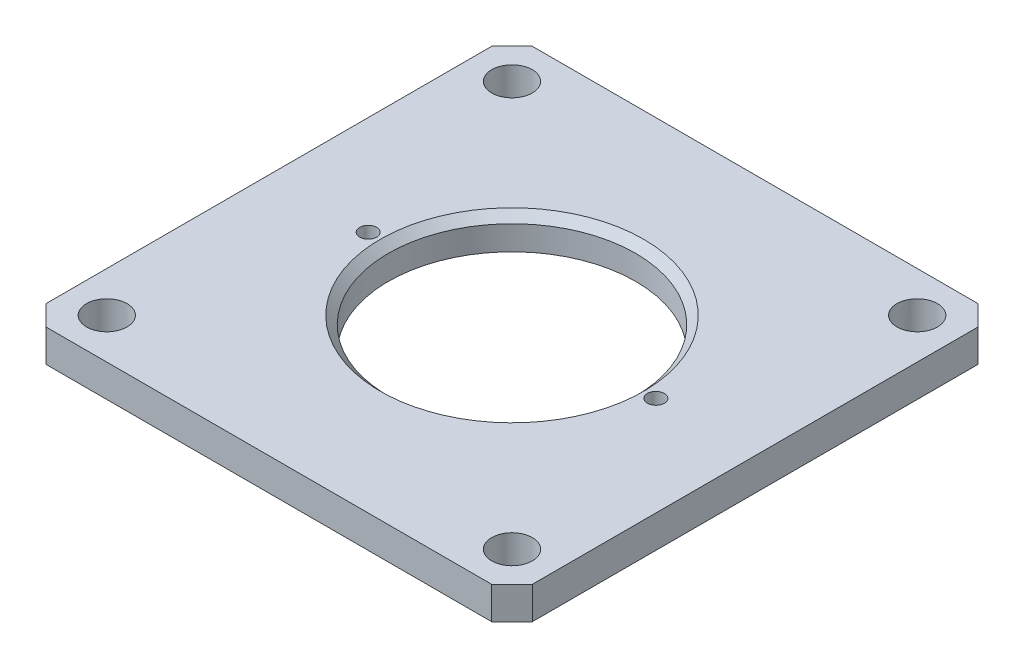
ISO-10303-21;
HEADER;
FILE_DESCRIPTION(('STEP AP214'),'2;1');
FILE_NAME('part.step','',(''),(''),'','','');
FILE_SCHEMA(('AUTOMOTIVE_DESIGN { 1 0 10303 214 1 1 1 1 }'));
ENDSEC;
DATA;
#1=APPLICATION_CONTEXT('core data for automotive mechanical design processes');
#2=APPLICATION_PROTOCOL_DEFINITION('international standard','automotive_design',2000,#1);
#3=PRODUCT_CONTEXT('',#1,'mechanical');
#4=PRODUCT('Part','Part','',(#3));
#5=PRODUCT_RELATED_PRODUCT_CATEGORY('part','',(#4));
#6=PRODUCT_DEFINITION_FORMATION('','',#4);
#7=PRODUCT_DEFINITION_CONTEXT('part definition',#1,'design');
#8=PRODUCT_DEFINITION('design','',#6,#7);
#9=PRODUCT_DEFINITION_SHAPE('','',#8);
#10=(LENGTH_UNIT() NAMED_UNIT(*) SI_UNIT(.MILLI.,.METRE.));
#11=(NAMED_UNIT(*) PLANE_ANGLE_UNIT() SI_UNIT($,.RADIAN.));
#12=(NAMED_UNIT(*) SI_UNIT($,.STERADIAN.) SOLID_ANGLE_UNIT());
#13=UNCERTAINTY_MEASURE_WITH_UNIT(LENGTH_MEASURE(1.E-05),#10,'distance_accuracy_value','');
#14=(GEOMETRIC_REPRESENTATION_CONTEXT(3) GLOBAL_UNCERTAINTY_ASSIGNED_CONTEXT((#13)) GLOBAL_UNIT_ASSIGNED_CONTEXT((#10,
#11,#12)) REPRESENTATION_CONTEXT('',''));
#15=CARTESIAN_POINT('',(0.,0.,0.));
#16=DIRECTION('',(0.,0.,1.));
#17=DIRECTION('',(1.,0.,0.));
#18=AXIS2_PLACEMENT_3D('',#15,#16,#17);
#19=CARTESIAN_POINT('',(0.,0.,0.));
#20=DIRECTION('',(0.,-1.,0.));
#21=DIRECTION('',(0.,0.,-1.));
#22=AXIS2_PLACEMENT_3D('',#19,#20,#21);
#23=PLANE('',#22);
#24=DIRECTION('',(-1.,0.,0.));
#25=VECTOR('',#24,1.);
#26=CARTESIAN_POINT('',(-60.,0.,-60.));
#27=LINE('',#26,#25);
#28=CARTESIAN_POINT('',(55.0000000000001,0.,-60.));
#29=VERTEX_POINT('',#28);
#30=CARTESIAN_POINT('',(-55.,0.,-60.));
#31=VERTEX_POINT('',#30);
#32=EDGE_CURVE('E121',#29,#31,#27,.T.);
#33=ORIENTED_EDGE('',*,*,#32,.F.);
#34=DIRECTION('',(-0.707106781186544,0.,-0.707106781186551));
#35=VECTOR('',#34,1.);
#36=CARTESIAN_POINT('',(57.5000000000003,0.,-57.4999999999997));
#37=LINE('',#36,#35);
#38=CARTESIAN_POINT('',(60.,0.,-55.));
#39=VERTEX_POINT('',#38);
#40=EDGE_CURVE('E104',#29,#39,#37,.F.);
#41=ORIENTED_EDGE('',*,*,#40,.T.);
#42=DIRECTION('',(0.,0.,-1.));
#43=VECTOR('',#42,1.);
#44=CARTESIAN_POINT('',(60.,0.,60.));
#45=LINE('',#44,#43);
#46=CARTESIAN_POINT('',(60.,0.,55.));
#47=VERTEX_POINT('',#46);
#48=EDGE_CURVE('E132',#47,#39,#45,.T.);
#49=ORIENTED_EDGE('',*,*,#48,.F.);
#50=DIRECTION('',(0.707106781186551,0.,-0.707106781186544));
#51=VECTOR('',#50,1.);
#52=CARTESIAN_POINT('',(57.4999999999997,0.,57.5000000000003));
#53=LINE('',#52,#51);
#54=CARTESIAN_POINT('',(55.,0.,60.));
#55=VERTEX_POINT('',#54);
#56=EDGE_CURVE('E115',#47,#55,#53,.F.);
#57=ORIENTED_EDGE('',*,*,#56,.T.);
#58=DIRECTION('',(1.,0.,0.));
#59=VECTOR('',#58,1.);
#60=CARTESIAN_POINT('',(-60.,0.,60.));
#61=LINE('',#60,#59);
#62=CARTESIAN_POINT('',(-55.,0.,60.));
#63=VERTEX_POINT('',#62);
#64=EDGE_CURVE('E136',#63,#55,#61,.T.);
#65=ORIENTED_EDGE('',*,*,#64,.F.);
#66=DIRECTION('',(0.707106781186545,0.,0.70710678118655));
#67=VECTOR('',#66,1.);
#68=CARTESIAN_POINT('',(-57.5000000000002,0.,57.4999999999998));
#69=LINE('',#68,#67);
#70=CARTESIAN_POINT('',(-60.,0.,55.));
#71=VERTEX_POINT('',#70);
#72=EDGE_CURVE('E125',#63,#71,#69,.F.);
#73=ORIENTED_EDGE('',*,*,#72,.T.);
#74=DIRECTION('',(0.,0.,1.));
#75=VECTOR('',#74,1.);
#76=CARTESIAN_POINT('',(-60.,0.,60.));
#77=LINE('',#76,#75);
#78=CARTESIAN_POINT('',(-60.,0.,-55.));
#79=VERTEX_POINT('',#78);
#80=EDGE_CURVE('E169',#79,#71,#77,.T.);
#81=ORIENTED_EDGE('',*,*,#80,.F.);
#82=DIRECTION('',(-0.707106781186549,0.,0.707106781186546));
#83=VECTOR('',#82,1.);
#84=CARTESIAN_POINT('',(-57.4999999999998,0.,-57.5000000000001));
#85=LINE('',#84,#83);
#86=EDGE_CURVE('E130',#79,#31,#85,.F.);
#87=ORIENTED_EDGE('',*,*,#86,.T.);
#88=EDGE_LOOP('',(#33,#41,#49,#57,#65,#73,#81,#87));
#89=FACE_BOUND('',#88,.T.);
#90=CARTESIAN_POINT('',(0.,0.,0.));
#91=DIRECTION('',(0.,-1.,0.));
#92=DIRECTION('',(0.,0.,-1.));
#93=AXIS2_PLACEMENT_3D('',#90,#91,#92);
#94=CIRCLE('',#93,30.5);
#95=CARTESIAN_POINT('',(0.,0.,-30.5));
#96=VERTEX_POINT('',#95);
#97=EDGE_CURVE('E178',#96,#96,#94,.F.);
#98=ORIENTED_EDGE('',*,*,#97,.T.);
#99=EDGE_LOOP('',(#98));
#100=FACE_BOUND('',#99,.T.);
#101=CARTESIAN_POINT('',(-50.,0.,-50.));
#102=DIRECTION('',(0.,-1.,0.));
#103=DIRECTION('',(0.,0.,-1.));
#104=AXIS2_PLACEMENT_3D('',#101,#102,#103);
#105=CIRCLE('',#104,5.00000000000001);
#106=CARTESIAN_POINT('',(-50.,0.,-55.));
#107=VERTEX_POINT('',#106);
#108=EDGE_CURVE('E188',#107,#107,#105,.F.);
#109=ORIENTED_EDGE('',*,*,#108,.T.);
#110=EDGE_LOOP('',(#109));
#111=FACE_BOUND('',#110,.T.);
#112=CARTESIAN_POINT('',(50.,0.,-50.));
#113=DIRECTION('',(0.,-1.,0.));
#114=DIRECTION('',(0.,0.,-1.));
#115=AXIS2_PLACEMENT_3D('',#112,#113,#114);
#116=CIRCLE('',#115,5.00000000000001);
#117=CARTESIAN_POINT('',(50.,0.,-55.));
#118=VERTEX_POINT('',#117);
#119=EDGE_CURVE('E194',#118,#118,#116,.F.);
#120=ORIENTED_EDGE('',*,*,#119,.T.);
#121=EDGE_LOOP('',(#120));
#122=FACE_BOUND('',#121,.T.);
#123=CARTESIAN_POINT('',(-50.,0.,50.));
#124=DIRECTION('',(0.,-1.,0.));
#125=DIRECTION('',(0.,0.,-1.));
#126=AXIS2_PLACEMENT_3D('',#123,#124,#125);
#127=CIRCLE('',#126,5.00000000000001);
#128=CARTESIAN_POINT('',(-50.,0.,45.));
#129=VERTEX_POINT('',#128);
#130=EDGE_CURVE('E200',#129,#129,#127,.F.);
#131=ORIENTED_EDGE('',*,*,#130,.T.);
#132=EDGE_LOOP('',(#131));
#133=FACE_BOUND('',#132,.T.);
#134=CARTESIAN_POINT('',(50.,0.,50.));
#135=DIRECTION('',(0.,-1.,0.));
#136=DIRECTION('',(0.,0.,-1.));
#137=AXIS2_PLACEMENT_3D('',#134,#135,#136);
#138=CIRCLE('',#137,5.00000000000001);
#139=CARTESIAN_POINT('',(50.,0.,45.));
#140=VERTEX_POINT('',#139);
#141=EDGE_CURVE('E206',#140,#140,#138,.F.);
#142=ORIENTED_EDGE('',*,*,#141,.T.);
#143=EDGE_LOOP('',(#142));
#144=FACE_BOUND('',#143,.T.);
#145=CARTESIAN_POINT('',(35.5,0.,0.));
#146=DIRECTION('',(0.,1.,0.));
#147=DIRECTION('',(0.,0.,1.));
#148=AXIS2_PLACEMENT_3D('',#145,#146,#147);
#149=CIRCLE('',#148,2.1);
#150=CARTESIAN_POINT('',(35.5,0.,2.09999999999998));
#151=VERTEX_POINT('',#150);
#152=EDGE_CURVE('E209',#151,#151,#149,.T.);
#153=ORIENTED_EDGE('',*,*,#152,.T.);
#154=EDGE_LOOP('',(#153));
#155=FACE_BOUND('',#154,.T.);
#156=CARTESIAN_POINT('',(-35.5,0.,0.));
#157=DIRECTION('',(0.,1.,0.));
#158=DIRECTION('',(0.,0.,1.));
#159=AXIS2_PLACEMENT_3D('',#156,#157,#158);
#160=CIRCLE('',#159,2.1);
#161=CARTESIAN_POINT('',(-35.5,0.,2.1));
#162=VERTEX_POINT('',#161);
#163=EDGE_CURVE('E217',#162,#162,#160,.T.);
#164=ORIENTED_EDGE('',*,*,#163,.T.);
#165=EDGE_LOOP('',(#164));
#166=FACE_BOUND('',#165,.T.);
#167=ADVANCED_FACE('F37',(#89,#100,#111,#122,#133,#144,#155,#166),#23,.T.);
#168=CARTESIAN_POINT('',(0.,8.,0.));
#169=DIRECTION('',(0.,-1.,0.));
#170=DIRECTION('',(0.,0.,-1.));
#171=AXIS2_PLACEMENT_3D('',#168,#169,#170);
#172=PLANE('',#171);
#173=DIRECTION('',(0.,0.,-1.));
#174=VECTOR('',#173,1.);
#175=CARTESIAN_POINT('',(60.,8.,60.));
#176=LINE('',#175,#174);
#177=CARTESIAN_POINT('',(60.,8.,55.));
#178=VERTEX_POINT('',#177);
#179=CARTESIAN_POINT('',(60.,8.,-55.));
#180=VERTEX_POINT('',#179);
#181=EDGE_CURVE('E182',#178,#180,#176,.T.);
#182=ORIENTED_EDGE('',*,*,#181,.T.);
#183=DIRECTION('',(0.707106781186544,0.,0.707106781186551));
#184=VECTOR('',#183,1.);
#185=CARTESIAN_POINT('',(55.,8.,-60.));
#186=LINE('',#185,#184);
#187=CARTESIAN_POINT('',(55.,8.,-60.));
#188=VERTEX_POINT('',#187);
#189=EDGE_CURVE('E158',#180,#188,#186,.F.);
#190=ORIENTED_EDGE('',*,*,#189,.T.);
#191=DIRECTION('',(-1.,0.,0.));
#192=VECTOR('',#191,1.);
#193=CARTESIAN_POINT('',(-60.,8.,-60.));
#194=LINE('',#193,#192);
#195=CARTESIAN_POINT('',(-55.,8.,-60.));
#196=VERTEX_POINT('',#195);
#197=EDGE_CURVE('E124',#188,#196,#194,.T.);
#198=ORIENTED_EDGE('',*,*,#197,.T.);
#199=DIRECTION('',(0.707106781186549,0.,-0.707106781186546));
#200=VECTOR('',#199,1.);
#201=CARTESIAN_POINT('',(-60.,8.,-55.));
#202=LINE('',#201,#200);
#203=CARTESIAN_POINT('',(-60.,8.,-55.));
#204=VERTEX_POINT('',#203);
#205=EDGE_CURVE('E154',#196,#204,#202,.F.);
#206=ORIENTED_EDGE('',*,*,#205,.T.);
#207=DIRECTION('',(0.,0.,1.));
#208=VECTOR('',#207,1.);
#209=CARTESIAN_POINT('',(-60.,8.,60.));
#210=LINE('',#209,#208);
#211=CARTESIAN_POINT('',(-60.,8.,55.));
#212=VERTEX_POINT('',#211);
#213=EDGE_CURVE('E131',#204,#212,#210,.T.);
#214=ORIENTED_EDGE('',*,*,#213,.T.);
#215=DIRECTION('',(-0.707106781186545,0.,-0.70710678118655));
#216=VECTOR('',#215,1.);
#217=CARTESIAN_POINT('',(-55.,8.,60.));
#218=LINE('',#217,#216);
#219=CARTESIAN_POINT('',(-55.,8.,60.));
#220=VERTEX_POINT('',#219);
#221=EDGE_CURVE('E59',#212,#220,#218,.F.);
#222=ORIENTED_EDGE('',*,*,#221,.T.);
#223=DIRECTION('',(1.,0.,0.));
#224=VECTOR('',#223,1.);
#225=CARTESIAN_POINT('',(-60.,8.,60.));
#226=LINE('',#225,#224);
#227=CARTESIAN_POINT('',(54.9999999999999,8.,60.));
#228=VERTEX_POINT('',#227);
#229=EDGE_CURVE('E134',#220,#228,#226,.T.);
#230=ORIENTED_EDGE('',*,*,#229,.T.);
#231=DIRECTION('',(-0.707106781186551,0.,0.707106781186544));
#232=VECTOR('',#231,1.);
#233=CARTESIAN_POINT('',(60.,8.,55.));
#234=LINE('',#233,#232);
#235=EDGE_CURVE('E156',#228,#178,#234,.F.);
#236=ORIENTED_EDGE('',*,*,#235,.T.);
#237=EDGE_LOOP('',(#182,#190,#198,#206,#214,#222,#230,#236));
#238=FACE_BOUND('',#237,.T.);
#239=CARTESIAN_POINT('',(0.,8.,0.));
#240=DIRECTION('',(0.,-1.,0.));
#241=DIRECTION('',(0.,0.,-1.));
#242=AXIS2_PLACEMENT_3D('',#239,#240,#241);
#243=CIRCLE('',#242,32.5);
#244=CARTESIAN_POINT('',(0.,8.,-32.5));
#245=VERTEX_POINT('',#244);
#246=EDGE_CURVE('E143',#245,#245,#243,.T.);
#247=ORIENTED_EDGE('',*,*,#246,.T.);
#248=EDGE_LOOP('',(#247));
#249=FACE_BOUND('',#248,.T.);
#250=CARTESIAN_POINT('',(-50.,8.,-50.));
#251=DIRECTION('',(0.,1.,0.));
#252=DIRECTION('',(0.,0.,1.));
#253=AXIS2_PLACEMENT_3D('',#250,#251,#252);
#254=CIRCLE('',#253,5.00000000000001);
#255=CARTESIAN_POINT('',(-50.,8.,-45.));
#256=VERTEX_POINT('',#255);
#257=EDGE_CURVE('E187',#256,#256,#254,.T.);
#258=ORIENTED_EDGE('',*,*,#257,.F.);
#259=EDGE_LOOP('',(#258));
#260=FACE_BOUND('',#259,.T.);
#261=CARTESIAN_POINT('',(50.,8.,-50.));
#262=DIRECTION('',(0.,1.,0.));
#263=DIRECTION('',(0.,0.,1.));
#264=AXIS2_PLACEMENT_3D('',#261,#262,#263);
#265=CIRCLE('',#264,5.00000000000001);
#266=CARTESIAN_POINT('',(50.,8.,-45.));
#267=VERTEX_POINT('',#266);
#268=EDGE_CURVE('E191',#267,#267,#265,.T.);
#269=ORIENTED_EDGE('',*,*,#268,.F.);
#270=EDGE_LOOP('',(#269));
#271=FACE_BOUND('',#270,.T.);
#272=CARTESIAN_POINT('',(-50.,8.,50.));
#273=DIRECTION('',(0.,1.,0.));
#274=DIRECTION('',(0.,0.,1.));
#275=AXIS2_PLACEMENT_3D('',#272,#273,#274);
#276=CIRCLE('',#275,5.00000000000001);
#277=CARTESIAN_POINT('',(-50.,8.,55.));
#278=VERTEX_POINT('',#277);
#279=EDGE_CURVE('E197',#278,#278,#276,.T.);
#280=ORIENTED_EDGE('',*,*,#279,.F.);
#281=EDGE_LOOP('',(#280));
#282=FACE_BOUND('',#281,.T.);
#283=CARTESIAN_POINT('',(50.,8.,50.));
#284=DIRECTION('',(0.,1.,0.));
#285=DIRECTION('',(0.,0.,1.));
#286=AXIS2_PLACEMENT_3D('',#283,#284,#285);
#287=CIRCLE('',#286,5.00000000000001);
#288=CARTESIAN_POINT('',(50.,8.,55.));
#289=VERTEX_POINT('',#288);
#290=EDGE_CURVE('E203',#289,#289,#287,.T.);
#291=ORIENTED_EDGE('',*,*,#290,.F.);
#292=EDGE_LOOP('',(#291));
#293=FACE_BOUND('',#292,.T.);
#294=CARTESIAN_POINT('',(35.5,8.,0.));
#295=DIRECTION('',(0.,1.,0.));
#296=DIRECTION('',(0.,0.,1.));
#297=AXIS2_PLACEMENT_3D('',#294,#295,#296);
#298=CIRCLE('',#297,2.1);
#299=CARTESIAN_POINT('',(35.5,8.,2.09999999999998));
#300=VERTEX_POINT('',#299);
#301=EDGE_CURVE('E214',#300,#300,#298,.T.);
#302=ORIENTED_EDGE('',*,*,#301,.F.);
#303=EDGE_LOOP('',(#302));
#304=FACE_BOUND('',#303,.T.);
#305=CARTESIAN_POINT('',(-35.5,8.,0.));
#306=DIRECTION('',(0.,1.,0.));
#307=DIRECTION('',(0.,0.,1.));
#308=AXIS2_PLACEMENT_3D('',#305,#306,#307);
#309=CIRCLE('',#308,2.1);
#310=CARTESIAN_POINT('',(-35.5,8.,2.1));
#311=VERTEX_POINT('',#310);
#312=EDGE_CURVE('E220',#311,#311,#309,.T.);
#313=ORIENTED_EDGE('',*,*,#312,.F.);
#314=EDGE_LOOP('',(#313));
#315=FACE_BOUND('',#314,.T.);
#316=ADVANCED_FACE('F172',(#238,#249,#260,#271,#282,#293,#304,#315),#172,.F.);
#317=CARTESIAN_POINT('',(-60.,8.,60.));
#318=DIRECTION('',(1.,0.,0.));
#319=DIRECTION('',(0.,0.,-1.));
#320=AXIS2_PLACEMENT_3D('',#317,#318,#319);
#321=PLANE('',#320);
#322=ORIENTED_EDGE('',*,*,#213,.F.);
#323=DIRECTION('',(0.,-1.,0.));
#324=VECTOR('',#323,1.);
#325=CARTESIAN_POINT('',(-60.,8.,-55.));
#326=LINE('',#325,#324);
#327=EDGE_CURVE('E11',#204,#79,#326,.T.);
#328=ORIENTED_EDGE('',*,*,#327,.T.);
#329=ORIENTED_EDGE('',*,*,#80,.T.);
#330=DIRECTION('',(0.,1.,0.));
#331=VECTOR('',#330,1.);
#332=CARTESIAN_POINT('',(-60.,8.,55.));
#333=LINE('',#332,#331);
#334=EDGE_CURVE('E45',#71,#212,#333,.T.);
#335=ORIENTED_EDGE('',*,*,#334,.T.);
#336=EDGE_LOOP('',(#322,#328,#329,#335));
#337=FACE_BOUND('',#336,.T.);
#338=ADVANCED_FACE('F167',(#337),#321,.F.);
#339=CARTESIAN_POINT('',(-60.,8.,60.));
#340=DIRECTION('',(0.,0.,-1.));
#341=DIRECTION('',(-1.,0.,0.));
#342=AXIS2_PLACEMENT_3D('',#339,#340,#341);
#343=PLANE('',#342);
#344=ORIENTED_EDGE('',*,*,#64,.T.);
#345=DIRECTION('',(0.,1.,0.));
#346=VECTOR('',#345,1.);
#347=CARTESIAN_POINT('',(55.,8.,60.));
#348=LINE('',#347,#346);
#349=EDGE_CURVE('E52',#55,#228,#348,.T.);
#350=ORIENTED_EDGE('',*,*,#349,.T.);
#351=ORIENTED_EDGE('',*,*,#229,.F.);
#352=DIRECTION('',(0.,-1.,0.));
#353=VECTOR('',#352,1.);
#354=CARTESIAN_POINT('',(-55.,8.,60.));
#355=LINE('',#354,#353);
#356=EDGE_CURVE('E160',#220,#63,#355,.T.);
#357=ORIENTED_EDGE('',*,*,#356,.T.);
#358=EDGE_LOOP('',(#344,#350,#351,#357));
#359=FACE_BOUND('',#358,.T.);
#360=ADVANCED_FACE('F177',(#359),#343,.F.);
#361=CARTESIAN_POINT('',(60.,8.,60.));
#362=DIRECTION('',(-1.,0.,0.));
#363=DIRECTION('',(0.,0.,1.));
#364=AXIS2_PLACEMENT_3D('',#361,#362,#363);
#365=PLANE('',#364);
#366=ORIENTED_EDGE('',*,*,#48,.T.);
#367=DIRECTION('',(0.,1.,0.));
#368=VECTOR('',#367,1.);
#369=CARTESIAN_POINT('',(60.,8.,-55.));
#370=LINE('',#369,#368);
#371=EDGE_CURVE('E109',#39,#180,#370,.T.);
#372=ORIENTED_EDGE('',*,*,#371,.T.);
#373=ORIENTED_EDGE('',*,*,#181,.F.);
#374=DIRECTION('',(0.,-1.,0.));
#375=VECTOR('',#374,1.);
#376=CARTESIAN_POINT('',(60.,8.,55.));
#377=LINE('',#376,#375);
#378=EDGE_CURVE('E114',#178,#47,#377,.T.);
#379=ORIENTED_EDGE('',*,*,#378,.T.);
#380=EDGE_LOOP('',(#366,#372,#373,#379));
#381=FACE_BOUND('',#380,.T.);
#382=ADVANCED_FACE('F240',(#381),#365,.F.);
#383=CARTESIAN_POINT('',(-60.,8.,-60.));
#384=DIRECTION('',(0.,0.,1.));
#385=DIRECTION('',(1.,0.,0.));
#386=AXIS2_PLACEMENT_3D('',#383,#384,#385);
#387=PLANE('',#386);
#388=ORIENTED_EDGE('',*,*,#197,.F.);
#389=DIRECTION('',(0.,-1.,0.));
#390=VECTOR('',#389,1.);
#391=CARTESIAN_POINT('',(55.,8.,-60.));
#392=LINE('',#391,#390);
#393=EDGE_CURVE('E108',#188,#29,#392,.T.);
#394=ORIENTED_EDGE('',*,*,#393,.T.);
#395=ORIENTED_EDGE('',*,*,#32,.T.);
#396=DIRECTION('',(0.,1.,0.));
#397=VECTOR('',#396,1.);
#398=CARTESIAN_POINT('',(-55.,8.,-60.));
#399=LINE('',#398,#397);
#400=EDGE_CURVE('E126',#31,#196,#399,.T.);
#401=ORIENTED_EDGE('',*,*,#400,.T.);
#402=EDGE_LOOP('',(#388,#394,#395,#401));
#403=FACE_BOUND('',#402,.T.);
#404=ADVANCED_FACE('F120',(#403),#387,.F.);
#405=CARTESIAN_POINT('',(0.,-0.000999999999999265,0.));
#406=DIRECTION('',(0.,1.,0.));
#407=DIRECTION('',(0.,0.,1.));
#408=AXIS2_PLACEMENT_3D('',#405,#406,#407);
#409=CYLINDRICAL_SURFACE('',#408,30.5);
#410=CARTESIAN_POINT('',(0.,6.00000000000002,0.));
#411=DIRECTION('',(0.,-1.,0.));
#412=DIRECTION('',(0.,0.,-1.));
#413=AXIS2_PLACEMENT_3D('',#410,#411,#412);
#414=CIRCLE('',#413,30.5);
#415=CARTESIAN_POINT('',(0.,6.00000000000002,-30.5));
#416=VERTEX_POINT('',#415);
#417=EDGE_CURVE('E140',#416,#416,#414,.F.);
#418=ORIENTED_EDGE('',*,*,#417,.T.);
#419=EDGE_LOOP('',(#418));
#420=FACE_BOUND('',#419,.T.);
#421=ORIENTED_EDGE('',*,*,#97,.F.);
#422=EDGE_LOOP('',(#421));
#423=FACE_BOUND('',#422,.T.);
#424=ADVANCED_FACE('F235',(#420,#423),#409,.F.);
#425=CARTESIAN_POINT('',(0.,6.00000000000002,0.));
#426=DIRECTION('',(0.,1.,0.));
#427=DIRECTION('',(0.,0.,1.));
#428=AXIS2_PLACEMENT_3D('',#425,#426,#427);
#429=CONICAL_SURFACE('',#428,30.5,0.785398163397449);
#430=ORIENTED_EDGE('',*,*,#246,.F.);
#431=EDGE_LOOP('',(#430));
#432=FACE_BOUND('',#431,.T.);
#433=ORIENTED_EDGE('',*,*,#417,.F.);
#434=EDGE_LOOP('',(#433));
#435=FACE_BOUND('',#434,.T.);
#436=ADVANCED_FACE('F246',(#432,#435),#429,.F.);
#437=CARTESIAN_POINT('',(-50.,-0.000999999999999265,-50.));
#438=DIRECTION('',(0.,1.,0.));
#439=DIRECTION('',(0.,0.,1.));
#440=AXIS2_PLACEMENT_3D('',#437,#438,#439);
#441=CYLINDRICAL_SURFACE('',#440,5.00000000000001);
#442=ORIENTED_EDGE('',*,*,#108,.F.);
#443=EDGE_LOOP('',(#442));
#444=FACE_BOUND('',#443,.T.);
#445=ORIENTED_EDGE('',*,*,#257,.T.);
#446=EDGE_LOOP('',(#445));
#447=FACE_BOUND('',#446,.T.);
#448=ADVANCED_FACE('F249',(#444,#447),#441,.F.);
#449=CARTESIAN_POINT('',(50.,-0.000999999999999265,-50.));
#450=DIRECTION('',(0.,1.,0.));
#451=DIRECTION('',(0.,0.,1.));
#452=AXIS2_PLACEMENT_3D('',#449,#450,#451);
#453=CYLINDRICAL_SURFACE('',#452,5.00000000000001);
#454=ORIENTED_EDGE('',*,*,#119,.F.);
#455=EDGE_LOOP('',(#454));
#456=FACE_BOUND('',#455,.T.);
#457=ORIENTED_EDGE('',*,*,#268,.T.);
#458=EDGE_LOOP('',(#457));
#459=FACE_BOUND('',#458,.T.);
#460=ADVANCED_FACE('F286',(#456,#459),#453,.F.);
#461=CARTESIAN_POINT('',(-50.,-0.000999999999999265,50.));
#462=DIRECTION('',(0.,1.,0.));
#463=DIRECTION('',(0.,0.,1.));
#464=AXIS2_PLACEMENT_3D('',#461,#462,#463);
#465=CYLINDRICAL_SURFACE('',#464,5.00000000000001);
#466=ORIENTED_EDGE('',*,*,#130,.F.);
#467=EDGE_LOOP('',(#466));
#468=FACE_BOUND('',#467,.T.);
#469=ORIENTED_EDGE('',*,*,#279,.T.);
#470=EDGE_LOOP('',(#469));
#471=FACE_BOUND('',#470,.T.);
#472=ADVANCED_FACE('F282',(#468,#471),#465,.F.);
#473=CARTESIAN_POINT('',(50.,-0.000999999999999265,50.));
#474=DIRECTION('',(0.,1.,0.));
#475=DIRECTION('',(0.,0.,1.));
#476=AXIS2_PLACEMENT_3D('',#473,#474,#475);
#477=CYLINDRICAL_SURFACE('',#476,5.00000000000001);
#478=ORIENTED_EDGE('',*,*,#141,.F.);
#479=EDGE_LOOP('',(#478));
#480=FACE_BOUND('',#479,.T.);
#481=ORIENTED_EDGE('',*,*,#290,.T.);
#482=EDGE_LOOP('',(#481));
#483=FACE_BOUND('',#482,.T.);
#484=ADVANCED_FACE('F254',(#480,#483),#477,.F.);
#485=CARTESIAN_POINT('',(55.,8.,-60.));
#486=DIRECTION('',(-0.707106781186551,0.,0.707106781186544));
#487=DIRECTION('',(0.,-1.,0.));
#488=AXIS2_PLACEMENT_3D('',#485,#486,#487);
#489=PLANE('',#488);
#490=ORIENTED_EDGE('',*,*,#189,.F.);
#491=ORIENTED_EDGE('',*,*,#371,.F.);
#492=ORIENTED_EDGE('',*,*,#40,.F.);
#493=ORIENTED_EDGE('',*,*,#393,.F.);
#494=EDGE_LOOP('',(#490,#491,#492,#493));
#495=FACE_BOUND('',#494,.T.);
#496=ADVANCED_FACE('F107',(#495),#489,.F.);
#497=CARTESIAN_POINT('',(60.,8.,55.));
#498=DIRECTION('',(-0.707106781186544,0.,-0.707106781186551));
#499=DIRECTION('',(0.,-1.,0.));
#500=AXIS2_PLACEMENT_3D('',#497,#498,#499);
#501=PLANE('',#500);
#502=ORIENTED_EDGE('',*,*,#235,.F.);
#503=ORIENTED_EDGE('',*,*,#349,.F.);
#504=ORIENTED_EDGE('',*,*,#56,.F.);
#505=ORIENTED_EDGE('',*,*,#378,.F.);
#506=EDGE_LOOP('',(#502,#503,#504,#505));
#507=FACE_BOUND('',#506,.T.);
#508=ADVANCED_FACE('F253',(#507),#501,.F.);
#509=CARTESIAN_POINT('',(-60.,8.,-55.));
#510=DIRECTION('',(0.707106781186545,0.,0.707106781186549));
#511=DIRECTION('',(0.,-1.,0.));
#512=AXIS2_PLACEMENT_3D('',#509,#510,#511);
#513=PLANE('',#512);
#514=ORIENTED_EDGE('',*,*,#205,.F.);
#515=ORIENTED_EDGE('',*,*,#400,.F.);
#516=ORIENTED_EDGE('',*,*,#86,.F.);
#517=ORIENTED_EDGE('',*,*,#327,.F.);
#518=EDGE_LOOP('',(#514,#515,#516,#517));
#519=FACE_BOUND('',#518,.T.);
#520=ADVANCED_FACE('F256',(#519),#513,.F.);
#521=CARTESIAN_POINT('',(-55.,8.,60.));
#522=DIRECTION('',(0.70710678118655,0.,-0.707106781186545));
#523=DIRECTION('',(0.,-1.,0.));
#524=AXIS2_PLACEMENT_3D('',#521,#522,#523);
#525=PLANE('',#524);
#526=ORIENTED_EDGE('',*,*,#221,.F.);
#527=ORIENTED_EDGE('',*,*,#334,.F.);
#528=ORIENTED_EDGE('',*,*,#72,.F.);
#529=ORIENTED_EDGE('',*,*,#356,.F.);
#530=EDGE_LOOP('',(#526,#527,#528,#529));
#531=FACE_BOUND('',#530,.T.);
#532=ADVANCED_FACE('F39',(#531),#525,.F.);
#533=CARTESIAN_POINT('',(35.5,8.,0.));
#534=DIRECTION('',(0.,1.,0.));
#535=DIRECTION('',(0.,0.,1.));
#536=AXIS2_PLACEMENT_3D('',#533,#534,#535);
#537=CYLINDRICAL_SURFACE('',#536,2.1);
#538=ORIENTED_EDGE('',*,*,#152,.F.);
#539=EDGE_LOOP('',(#538));
#540=FACE_BOUND('',#539,.T.);
#541=ORIENTED_EDGE('',*,*,#301,.T.);
#542=EDGE_LOOP('',(#541));
#543=FACE_BOUND('',#542,.T.);
#544=ADVANCED_FACE('F263',(#540,#543),#537,.F.);
#545=CARTESIAN_POINT('',(-35.5,8.,0.));
#546=DIRECTION('',(0.,1.,0.));
#547=DIRECTION('',(0.,0.,1.));
#548=AXIS2_PLACEMENT_3D('',#545,#546,#547);
#549=CYLINDRICAL_SURFACE('',#548,2.1);
#550=ORIENTED_EDGE('',*,*,#163,.F.);
#551=EDGE_LOOP('',(#550));
#552=FACE_BOUND('',#551,.T.);
#553=ORIENTED_EDGE('',*,*,#312,.T.);
#554=EDGE_LOOP('',(#553));
#555=FACE_BOUND('',#554,.T.);
#556=ADVANCED_FACE('F224',(#552,#555),#549,.F.);
#557=CLOSED_SHELL('',(#167,#316,#338,#360,#382,#404,#424,#436,#448,#460,#472,#484,#496,#508,
#520,#532,#544,#556));
#558=MANIFOLD_SOLID_BREP('B2',#557);
#559=ADVANCED_BREP_SHAPE_REPRESENTATION('',(#18,#558),#14);
#560=SHAPE_DEFINITION_REPRESENTATION(#9,#559);
ENDSEC;
END-ISO-10303-21;
